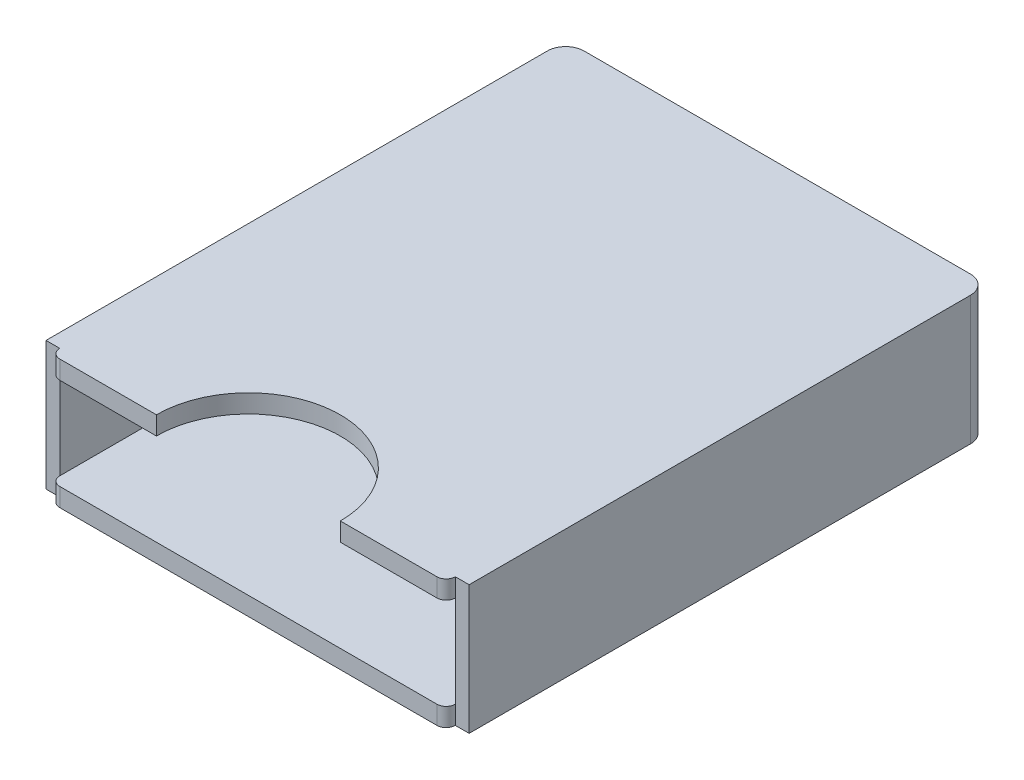
ISO-10303-21;
HEADER;
FILE_DESCRIPTION(('STEP AP214'),'2;1');
FILE_NAME('part.step','',(''),(''),'','','');
FILE_SCHEMA(('AUTOMOTIVE_DESIGN { 1 0 10303 214 1 1 1 1 }'));
ENDSEC;
DATA;
#1=APPLICATION_CONTEXT('core data for automotive mechanical design processes');
#2=APPLICATION_PROTOCOL_DEFINITION('international standard','automotive_design',2000,#1);
#3=PRODUCT_CONTEXT('',#1,'mechanical');
#4=PRODUCT('Part','Part','',(#3));
#5=PRODUCT_RELATED_PRODUCT_CATEGORY('part','',(#4));
#6=PRODUCT_DEFINITION_FORMATION('','',#4);
#7=PRODUCT_DEFINITION_CONTEXT('part definition',#1,'design');
#8=PRODUCT_DEFINITION('design','',#6,#7);
#9=PRODUCT_DEFINITION_SHAPE('','',#8);
#10=(LENGTH_UNIT() NAMED_UNIT(*) SI_UNIT(.MILLI.,.METRE.));
#11=(NAMED_UNIT(*) PLANE_ANGLE_UNIT() SI_UNIT($,.RADIAN.));
#12=(NAMED_UNIT(*) SI_UNIT($,.STERADIAN.) SOLID_ANGLE_UNIT());
#13=UNCERTAINTY_MEASURE_WITH_UNIT(LENGTH_MEASURE(1.E-05),#10,'distance_accuracy_value','');
#14=(GEOMETRIC_REPRESENTATION_CONTEXT(3) GLOBAL_UNCERTAINTY_ASSIGNED_CONTEXT((#13)) GLOBAL_UNIT_ASSIGNED_CONTEXT((#10,
#11,#12)) REPRESENTATION_CONTEXT('',''));
#15=CARTESIAN_POINT('',(0.,0.,0.));
#16=DIRECTION('',(0.,0.,1.));
#17=DIRECTION('',(1.,0.,0.));
#18=AXIS2_PLACEMENT_3D('',#15,#16,#17);
#19=CARTESIAN_POINT('',(0.,7.,14.));
#20=DIRECTION('',(0.,0.,1.));
#21=DIRECTION('',(1.,0.,0.));
#22=AXIS2_PLACEMENT_3D('',#19,#20,#21);
#23=PLANE('',#22);
#24=DIRECTION('',(0.,1.,0.));
#25=VECTOR('',#24,1.);
#26=CARTESIAN_POINT('',(5.,6.,14.));
#27=LINE('',#26,#25);
#28=CARTESIAN_POINT('',(5.,6.,14.));
#29=VERTEX_POINT('',#28);
#30=CARTESIAN_POINT('',(5.,7.,14.));
#31=VERTEX_POINT('',#30);
#32=EDGE_CURVE('E227',#29,#31,#27,.T.);
#33=ORIENTED_EDGE('',*,*,#32,.F.);
#34=DIRECTION('',(-1.,0.,0.));
#35=VECTOR('',#34,1.);
#36=CARTESIAN_POINT('',(0.,6.,14.));
#37=LINE('',#36,#35);
#38=CARTESIAN_POINT('',(10.25,6.,14.));
#39=VERTEX_POINT('',#38);
#40=EDGE_CURVE('E236',#39,#29,#37,.T.);
#41=ORIENTED_EDGE('',*,*,#40,.F.);
#42=DIRECTION('',(0.,-1.,0.));
#43=VECTOR('',#42,1.);
#44=CARTESIAN_POINT('',(10.25,7.,14.));
#45=LINE('',#44,#43);
#46=CARTESIAN_POINT('',(10.25,7.,14.));
#47=VERTEX_POINT('',#46);
#48=EDGE_CURVE('E264',#47,#39,#45,.T.);
#49=ORIENTED_EDGE('',*,*,#48,.F.);
#50=DIRECTION('',(-1.,0.,0.));
#51=VECTOR('',#50,1.);
#52=CARTESIAN_POINT('',(0.,7.,14.));
#53=LINE('',#52,#51);
#54=EDGE_CURVE('E261',#47,#31,#53,.T.);
#55=ORIENTED_EDGE('',*,*,#54,.T.);
#56=EDGE_LOOP('',(#33,#41,#49,#55));
#57=FACE_BOUND('',#56,.T.);
#58=ADVANCED_FACE('F35',(#57),#23,.T.);
#59=CARTESIAN_POINT('',(0.,1.,0.));
#60=DIRECTION('',(0.,1.,0.));
#61=DIRECTION('',(0.,0.,1.));
#62=AXIS2_PLACEMENT_3D('',#59,#60,#61);
#63=PLANE('',#62);
#64=DIRECTION('',(1.,0.,0.));
#65=VECTOR('',#64,1.);
#66=CARTESIAN_POINT('',(0.,1.,-14.));
#67=LINE('',#66,#65);
#68=CARTESIAN_POINT('',(5.,1.,-14.));
#69=VERTEX_POINT('',#68);
#70=CARTESIAN_POINT('',(10.25,1.,-14.));
#71=VERTEX_POINT('',#70);
#72=EDGE_CURVE('E313',#69,#71,#67,.T.);
#73=ORIENTED_EDGE('',*,*,#72,.F.);
#74=DIRECTION('',(0.,0.,-1.));
#75=VECTOR('',#74,1.);
#76=CARTESIAN_POINT('',(5.,1.,-4.75));
#77=LINE('',#76,#75);
#78=CARTESIAN_POINT('',(5.,1.,-14.75));
#79=VERTEX_POINT('',#78);
#80=EDGE_CURVE('E201',#69,#79,#77,.T.);
#81=ORIENTED_EDGE('',*,*,#80,.T.);
#82=DIRECTION('',(-1.,0.,0.));
#83=VECTOR('',#82,1.);
#84=CARTESIAN_POINT('',(-5.,1.,-14.75));
#85=LINE('',#84,#83);
#86=CARTESIAN_POINT('',(-5.,1.,-14.75));
#87=VERTEX_POINT('',#86);
#88=EDGE_CURVE('E212',#79,#87,#85,.T.);
#89=ORIENTED_EDGE('',*,*,#88,.T.);
#90=DIRECTION('',(0.,0.,-1.));
#91=VECTOR('',#90,1.);
#92=CARTESIAN_POINT('',(-5.,1.,-4.75));
#93=LINE('',#92,#91);
#94=CARTESIAN_POINT('',(-5.,1.,-14.));
#95=VERTEX_POINT('',#94);
#96=EDGE_CURVE('E217',#95,#87,#93,.T.);
#97=ORIENTED_EDGE('',*,*,#96,.F.);
#98=CARTESIAN_POINT('',(-10.25,1.,-14.));
#99=VERTEX_POINT('',#98);
#100=EDGE_CURVE('E314',#99,#95,#67,.T.);
#101=ORIENTED_EDGE('',*,*,#100,.F.);
#102=CARTESIAN_POINT('',(-10.25,1.,-13.5));
#103=DIRECTION('',(0.,1.,0.));
#104=DIRECTION('',(0.,0.,1.));
#105=AXIS2_PLACEMENT_3D('',#102,#103,#104);
#106=CIRCLE('',#105,0.5);
#107=CARTESIAN_POINT('',(-10.75,1.,-13.5));
#108=VERTEX_POINT('',#107);
#109=EDGE_CURVE('E317',#99,#108,#106,.T.);
#110=ORIENTED_EDGE('',*,*,#109,.T.);
#111=DIRECTION('',(0.,0.,-1.));
#112=VECTOR('',#111,1.);
#113=CARTESIAN_POINT('',(-10.75,1.,0.));
#114=LINE('',#113,#112);
#115=CARTESIAN_POINT('',(-10.75,1.,13.5));
#116=VERTEX_POINT('',#115);
#117=EDGE_CURVE('E319',#116,#108,#114,.T.);
#118=ORIENTED_EDGE('',*,*,#117,.F.);
#119=CARTESIAN_POINT('',(-10.25,1.,13.5));
#120=DIRECTION('',(0.,1.,0.));
#121=DIRECTION('',(0.,0.,1.));
#122=AXIS2_PLACEMENT_3D('',#119,#120,#121);
#123=CIRCLE('',#122,0.5);
#124=CARTESIAN_POINT('',(-10.25,1.,14.));
#125=VERTEX_POINT('',#124);
#126=EDGE_CURVE('E330',#116,#125,#123,.T.);
#127=ORIENTED_EDGE('',*,*,#126,.T.);
#128=DIRECTION('',(-1.,0.,0.));
#129=VECTOR('',#128,1.);
#130=CARTESIAN_POINT('',(0.,1.,14.));
#131=LINE('',#130,#129);
#132=CARTESIAN_POINT('',(10.25,1.,14.));
#133=VERTEX_POINT('',#132);
#134=EDGE_CURVE('E333',#133,#125,#131,.T.);
#135=ORIENTED_EDGE('',*,*,#134,.F.);
#136=CARTESIAN_POINT('',(10.25,1.,13.5));
#137=DIRECTION('',(0.,1.,0.));
#138=DIRECTION('',(0.,0.,1.));
#139=AXIS2_PLACEMENT_3D('',#136,#137,#138);
#140=CIRCLE('',#139,0.5);
#141=CARTESIAN_POINT('',(10.75,1.,13.5));
#142=VERTEX_POINT('',#141);
#143=EDGE_CURVE('E328',#133,#142,#140,.T.);
#144=ORIENTED_EDGE('',*,*,#143,.T.);
#145=DIRECTION('',(0.,0.,-1.));
#146=VECTOR('',#145,1.);
#147=CARTESIAN_POINT('',(10.75,1.,0.));
#148=LINE('',#147,#146);
#149=CARTESIAN_POINT('',(10.75,1.,-13.5));
#150=VERTEX_POINT('',#149);
#151=EDGE_CURVE('E322',#142,#150,#148,.T.);
#152=ORIENTED_EDGE('',*,*,#151,.T.);
#153=CARTESIAN_POINT('',(10.25,1.,-13.5));
#154=DIRECTION('',(0.,1.,0.));
#155=DIRECTION('',(0.,0.,1.));
#156=AXIS2_PLACEMENT_3D('',#153,#154,#155);
#157=CIRCLE('',#156,0.5);
#158=EDGE_CURVE('E324',#71,#150,#157,.F.);
#159=ORIENTED_EDGE('',*,*,#158,.F.);
#160=EDGE_LOOP('',(#73,#81,#89,#97,#101,#110,#118,#127,#135,#144,#152,#159));
#161=FACE_BOUND('',#160,.T.);
#162=ADVANCED_FACE('F395',(#161),#63,.T.);
#163=CARTESIAN_POINT('',(10.25,1.,13.5));
#164=DIRECTION('',(0.,-1.,0.));
#165=DIRECTION('',(0.,0.,-1.));
#166=AXIS2_PLACEMENT_3D('',#163,#164,#165);
#167=CYLINDRICAL_SURFACE('',#166,0.5);
#168=CARTESIAN_POINT('',(10.25,0.,13.5));
#169=DIRECTION('',(0.,1.,0.));
#170=DIRECTION('',(0.,0.,1.));
#171=AXIS2_PLACEMENT_3D('',#168,#169,#170);
#172=CIRCLE('',#171,0.5);
#173=CARTESIAN_POINT('',(10.25,0.,14.));
#174=VERTEX_POINT('',#173);
#175=CARTESIAN_POINT('',(10.75,0.,13.5));
#176=VERTEX_POINT('',#175);
#177=EDGE_CURVE('E327',#174,#176,#172,.T.);
#178=ORIENTED_EDGE('',*,*,#177,.T.);
#179=DIRECTION('',(0.,-1.,0.));
#180=VECTOR('',#179,1.);
#181=CARTESIAN_POINT('',(10.75,1.,13.5));
#182=LINE('',#181,#180);
#183=EDGE_CURVE('E382',#142,#176,#182,.T.);
#184=ORIENTED_EDGE('',*,*,#183,.F.);
#185=ORIENTED_EDGE('',*,*,#143,.F.);
#186=DIRECTION('',(0.,-1.,0.));
#187=VECTOR('',#186,1.);
#188=CARTESIAN_POINT('',(10.25,1.,14.));
#189=LINE('',#188,#187);
#190=EDGE_CURVE('E336',#133,#174,#189,.T.);
#191=ORIENTED_EDGE('',*,*,#190,.T.);
#192=EDGE_LOOP('',(#178,#184,#185,#191));
#193=FACE_BOUND('',#192,.T.);
#194=ADVANCED_FACE('F37',(#193),#167,.T.);
#195=CARTESIAN_POINT('',(0.,1.,13.4999999999999));
#196=DIRECTION('',(0.,0.,-1.));
#197=DIRECTION('',(-1.,0.,0.));
#198=AXIS2_PLACEMENT_3D('',#195,#196,#197);
#199=PLANE('',#198);
#200=DIRECTION('',(1.,0.,0.));
#201=VECTOR('',#200,1.);
#202=CARTESIAN_POINT('',(0.,0.,13.4999999999999));
#203=LINE('',#202,#201);
#204=CARTESIAN_POINT('',(11.5,0.,13.5));
#205=VERTEX_POINT('',#204);
#206=EDGE_CURVE('E339',#176,#205,#203,.T.);
#207=ORIENTED_EDGE('',*,*,#206,.T.);
#208=DIRECTION('',(0.,-1.,0.));
#209=VECTOR('',#208,1.);
#210=CARTESIAN_POINT('',(11.5,1.,13.5));
#211=LINE('',#210,#209);
#212=CARTESIAN_POINT('',(11.5,7.,13.5));
#213=VERTEX_POINT('',#212);
#214=EDGE_CURVE('E380',#213,#205,#211,.T.);
#215=ORIENTED_EDGE('',*,*,#214,.F.);
#216=DIRECTION('',(1.,0.,0.));
#217=VECTOR('',#216,1.);
#218=CARTESIAN_POINT('',(0.,7.,13.4999999999999));
#219=LINE('',#218,#217);
#220=CARTESIAN_POINT('',(10.75,7.,13.5));
#221=VERTEX_POINT('',#220);
#222=EDGE_CURVE('E235',#221,#213,#219,.T.);
#223=ORIENTED_EDGE('',*,*,#222,.F.);
#224=DIRECTION('',(0.,-1.,0.));
#225=VECTOR('',#224,1.);
#226=CARTESIAN_POINT('',(10.75,7.,13.5));
#227=LINE('',#226,#225);
#228=CARTESIAN_POINT('',(10.75,6.,13.5));
#229=VERTEX_POINT('',#228);
#230=EDGE_CURVE('E279',#221,#229,#227,.T.);
#231=ORIENTED_EDGE('',*,*,#230,.T.);
#232=DIRECTION('',(0.,-1.,0.));
#233=VECTOR('',#232,1.);
#234=CARTESIAN_POINT('',(10.75,6.,13.5));
#235=LINE('',#234,#233);
#236=EDGE_CURVE('E307',#229,#142,#235,.T.);
#237=ORIENTED_EDGE('',*,*,#236,.T.);
#238=ORIENTED_EDGE('',*,*,#183,.T.);
#239=EDGE_LOOP('',(#207,#215,#223,#231,#237,#238));
#240=FACE_BOUND('',#239,.T.);
#241=ADVANCED_FACE('F428',(#240),#199,.F.);
#242=CARTESIAN_POINT('',(11.5,1.,0.));
#243=DIRECTION('',(1.,0.,0.));
#244=DIRECTION('',(0.,0.,-1.));
#245=AXIS2_PLACEMENT_3D('',#242,#243,#244);
#246=PLANE('',#245);
#247=DIRECTION('',(0.,0.,1.));
#248=VECTOR('',#247,1.);
#249=CARTESIAN_POINT('',(11.5,0.,0.));
#250=LINE('',#249,#248);
#251=CARTESIAN_POINT('',(11.5,0.,-13.75));
#252=VERTEX_POINT('',#251);
#253=EDGE_CURVE('E342',#252,#205,#250,.T.);
#254=ORIENTED_EDGE('',*,*,#253,.F.);
#255=DIRECTION('',(0.,-1.,0.));
#256=VECTOR('',#255,1.);
#257=CARTESIAN_POINT('',(11.5,1.,-13.75));
#258=LINE('',#257,#256);
#259=CARTESIAN_POINT('',(11.5,7.,-13.75));
#260=VERTEX_POINT('',#259);
#261=EDGE_CURVE('E378',#260,#252,#258,.T.);
#262=ORIENTED_EDGE('',*,*,#261,.F.);
#263=DIRECTION('',(0.,0.,1.));
#264=VECTOR('',#263,1.);
#265=CARTESIAN_POINT('',(11.5,7.,0.));
#266=LINE('',#265,#264);
#267=EDGE_CURVE('E239',#260,#213,#266,.T.);
#268=ORIENTED_EDGE('',*,*,#267,.T.);
#269=ORIENTED_EDGE('',*,*,#214,.T.);
#270=EDGE_LOOP('',(#254,#262,#268,#269));
#271=FACE_BOUND('',#270,.T.);
#272=ADVANCED_FACE('F467',(#271),#246,.T.);
#273=CARTESIAN_POINT('',(10.5,1.,-13.75));
#274=DIRECTION('',(0.,-1.,0.));
#275=DIRECTION('',(0.,0.,-1.));
#276=AXIS2_PLACEMENT_3D('',#273,#274,#275);
#277=CYLINDRICAL_SURFACE('',#276,1.);
#278=CARTESIAN_POINT('',(10.5,0.,-13.75));
#279=DIRECTION('',(0.,1.,0.));
#280=DIRECTION('',(0.,0.,1.));
#281=AXIS2_PLACEMENT_3D('',#278,#279,#280);
#282=CIRCLE('',#281,1.);
#283=CARTESIAN_POINT('',(10.5,0.,-14.75));
#284=VERTEX_POINT('',#283);
#285=EDGE_CURVE('E345',#252,#284,#282,.T.);
#286=ORIENTED_EDGE('',*,*,#285,.T.);
#287=DIRECTION('',(0.,-1.,0.));
#288=VECTOR('',#287,1.);
#289=CARTESIAN_POINT('',(10.5,1.,-14.75));
#290=LINE('',#289,#288);
#291=CARTESIAN_POINT('',(10.5,7.,-14.75));
#292=VERTEX_POINT('',#291);
#293=EDGE_CURVE('E375',#292,#284,#290,.T.);
#294=ORIENTED_EDGE('',*,*,#293,.F.);
#295=CARTESIAN_POINT('',(10.5,7.,-13.75));
#296=DIRECTION('',(0.,1.,0.));
#297=DIRECTION('',(0.,0.,1.));
#298=AXIS2_PLACEMENT_3D('',#295,#296,#297);
#299=CIRCLE('',#298,1.);
#300=EDGE_CURVE('E242',#260,#292,#299,.T.);
#301=ORIENTED_EDGE('',*,*,#300,.F.);
#302=ORIENTED_EDGE('',*,*,#261,.T.);
#303=EDGE_LOOP('',(#286,#294,#301,#302));
#304=FACE_BOUND('',#303,.T.);
#305=ADVANCED_FACE('F470',(#304),#277,.T.);
#306=CARTESIAN_POINT('',(0.,1.,-14.75));
#307=DIRECTION('',(0.,0.,1.));
#308=DIRECTION('',(1.,0.,0.));
#309=AXIS2_PLACEMENT_3D('',#306,#307,#308);
#310=PLANE('',#309);
#311=DIRECTION('',(1.,0.,0.));
#312=VECTOR('',#311,1.);
#313=CARTESIAN_POINT('',(-5.,3.,-14.75));
#314=LINE('',#313,#312);
#315=CARTESIAN_POINT('',(-5.,3.,-14.75));
#316=VERTEX_POINT('',#315);
#317=CARTESIAN_POINT('',(5.,3.,-14.75));
#318=VERTEX_POINT('',#317);
#319=EDGE_CURVE('E205',#316,#318,#314,.T.);
#320=ORIENTED_EDGE('',*,*,#319,.F.);
#321=DIRECTION('',(0.,1.,0.));
#322=VECTOR('',#321,1.);
#323=CARTESIAN_POINT('',(-5.,1.,-14.75));
#324=LINE('',#323,#322);
#325=EDGE_CURVE('E50',#87,#316,#324,.T.);
#326=ORIENTED_EDGE('',*,*,#325,.F.);
#327=ORIENTED_EDGE('',*,*,#88,.F.);
#328=DIRECTION('',(0.,-1.,0.));
#329=VECTOR('',#328,1.);
#330=CARTESIAN_POINT('',(5.,1.,-14.75));
#331=LINE('',#330,#329);
#332=EDGE_CURVE('E197',#318,#79,#331,.T.);
#333=ORIENTED_EDGE('',*,*,#332,.F.);
#334=EDGE_LOOP('',(#320,#326,#327,#333));
#335=FACE_BOUND('',#334,.T.);
#336=DIRECTION('',(-1.,0.,0.));
#337=VECTOR('',#336,1.);
#338=CARTESIAN_POINT('',(0.,0.,-14.75));
#339=LINE('',#338,#337);
#340=CARTESIAN_POINT('',(-10.5,0.,-14.75));
#341=VERTEX_POINT('',#340);
#342=EDGE_CURVE('E347',#284,#341,#339,.T.);
#343=ORIENTED_EDGE('',*,*,#342,.T.);
#344=DIRECTION('',(0.,-1.,0.));
#345=VECTOR('',#344,1.);
#346=CARTESIAN_POINT('',(-10.5,1.,-14.75));
#347=LINE('',#346,#345);
#348=CARTESIAN_POINT('',(-10.5,7.,-14.75));
#349=VERTEX_POINT('',#348);
#350=EDGE_CURVE('E373',#349,#341,#347,.T.);
#351=ORIENTED_EDGE('',*,*,#350,.F.);
#352=DIRECTION('',(-1.,0.,0.));
#353=VECTOR('',#352,1.);
#354=CARTESIAN_POINT('',(0.,7.,-14.75));
#355=LINE('',#354,#353);
#356=EDGE_CURVE('E245',#292,#349,#355,.T.);
#357=ORIENTED_EDGE('',*,*,#356,.F.);
#358=ORIENTED_EDGE('',*,*,#293,.T.);
#359=EDGE_LOOP('',(#343,#351,#357,#358));
#360=FACE_BOUND('',#359,.T.);
#361=ADVANCED_FACE('F209',(#335,#360),#310,.F.);
#362=CARTESIAN_POINT('',(-10.5,1.,-13.75));
#363=DIRECTION('',(0.,-1.,0.));
#364=DIRECTION('',(0.,0.,-1.));
#365=AXIS2_PLACEMENT_3D('',#362,#363,#364);
#366=CYLINDRICAL_SURFACE('',#365,1.);
#367=CARTESIAN_POINT('',(-10.5,0.,-13.75));
#368=DIRECTION('',(0.,1.,0.));
#369=DIRECTION('',(0.,0.,1.));
#370=AXIS2_PLACEMENT_3D('',#367,#368,#369);
#371=CIRCLE('',#370,1.);
#372=CARTESIAN_POINT('',(-11.5,0.,-13.75));
#373=VERTEX_POINT('',#372);
#374=EDGE_CURVE('E350',#373,#341,#371,.F.);
#375=ORIENTED_EDGE('',*,*,#374,.F.);
#376=DIRECTION('',(0.,-1.,0.));
#377=VECTOR('',#376,1.);
#378=CARTESIAN_POINT('',(-11.5,1.,-13.75));
#379=LINE('',#378,#377);
#380=CARTESIAN_POINT('',(-11.5,7.,-13.75));
#381=VERTEX_POINT('',#380);
#382=EDGE_CURVE('E371',#381,#373,#379,.T.);
#383=ORIENTED_EDGE('',*,*,#382,.F.);
#384=CARTESIAN_POINT('',(-10.5,7.,-13.75));
#385=DIRECTION('',(0.,1.,0.));
#386=DIRECTION('',(0.,0.,1.));
#387=AXIS2_PLACEMENT_3D('',#384,#385,#386);
#388=CIRCLE('',#387,1.);
#389=EDGE_CURVE('E248',#381,#349,#388,.F.);
#390=ORIENTED_EDGE('',*,*,#389,.T.);
#391=ORIENTED_EDGE('',*,*,#350,.T.);
#392=EDGE_LOOP('',(#375,#383,#390,#391));
#393=FACE_BOUND('',#392,.T.);
#394=ADVANCED_FACE('F474',(#393),#366,.T.);
#395=CARTESIAN_POINT('',(-11.5,1.,0.));
#396=DIRECTION('',(1.,0.,0.));
#397=DIRECTION('',(0.,0.,-1.));
#398=AXIS2_PLACEMENT_3D('',#395,#396,#397);
#399=PLANE('',#398);
#400=DIRECTION('',(0.,0.,1.));
#401=VECTOR('',#400,1.);
#402=CARTESIAN_POINT('',(-11.5,0.,0.));
#403=LINE('',#402,#401);
#404=CARTESIAN_POINT('',(-11.5,0.,13.5));
#405=VERTEX_POINT('',#404);
#406=EDGE_CURVE('E353',#373,#405,#403,.T.);
#407=ORIENTED_EDGE('',*,*,#406,.T.);
#408=DIRECTION('',(0.,-1.,0.));
#409=VECTOR('',#408,1.);
#410=CARTESIAN_POINT('',(-11.5,1.,13.5));
#411=LINE('',#410,#409);
#412=CARTESIAN_POINT('',(-11.5,7.,13.5));
#413=VERTEX_POINT('',#412);
#414=EDGE_CURVE('E369',#413,#405,#411,.T.);
#415=ORIENTED_EDGE('',*,*,#414,.F.);
#416=DIRECTION('',(0.,0.,1.));
#417=VECTOR('',#416,1.);
#418=CARTESIAN_POINT('',(-11.5,7.,0.));
#419=LINE('',#418,#417);
#420=EDGE_CURVE('E251',#381,#413,#419,.T.);
#421=ORIENTED_EDGE('',*,*,#420,.F.);
#422=ORIENTED_EDGE('',*,*,#382,.T.);
#423=EDGE_LOOP('',(#407,#415,#421,#422));
#424=FACE_BOUND('',#423,.T.);
#425=ADVANCED_FACE('F458',(#424),#399,.F.);
#426=CARTESIAN_POINT('',(0.,1.,13.4999999999999));
#427=DIRECTION('',(0.,0.,1.));
#428=DIRECTION('',(1.,0.,0.));
#429=AXIS2_PLACEMENT_3D('',#426,#427,#428);
#430=PLANE('',#429);
#431=DIRECTION('',(-1.,0.,0.));
#432=VECTOR('',#431,1.);
#433=CARTESIAN_POINT('',(0.,0.,13.4999999999999));
#434=LINE('',#433,#432);
#435=CARTESIAN_POINT('',(-10.75,0.,13.5));
#436=VERTEX_POINT('',#435);
#437=EDGE_CURVE('E356',#436,#405,#434,.T.);
#438=ORIENTED_EDGE('',*,*,#437,.F.);
#439=DIRECTION('',(0.,-1.,0.));
#440=VECTOR('',#439,1.);
#441=CARTESIAN_POINT('',(-10.75,1.,13.5));
#442=LINE('',#441,#440);
#443=EDGE_CURVE('E367',#116,#436,#442,.T.);
#444=ORIENTED_EDGE('',*,*,#443,.F.);
#445=DIRECTION('',(0.,-1.,0.));
#446=VECTOR('',#445,1.);
#447=CARTESIAN_POINT('',(-10.75,6.,13.5));
#448=LINE('',#447,#446);
#449=CARTESIAN_POINT('',(-10.75,6.,13.5));
#450=VERTEX_POINT('',#449);
#451=EDGE_CURVE('E304',#450,#116,#448,.T.);
#452=ORIENTED_EDGE('',*,*,#451,.F.);
#453=DIRECTION('',(0.,-1.,0.));
#454=VECTOR('',#453,1.);
#455=CARTESIAN_POINT('',(-10.75,7.,13.5));
#456=LINE('',#455,#454);
#457=CARTESIAN_POINT('',(-10.75,7.,13.5));
#458=VERTEX_POINT('',#457);
#459=EDGE_CURVE('E277',#458,#450,#456,.T.);
#460=ORIENTED_EDGE('',*,*,#459,.F.);
#461=DIRECTION('',(-1.,0.,0.));
#462=VECTOR('',#461,1.);
#463=CARTESIAN_POINT('',(0.,7.,13.4999999999999));
#464=LINE('',#463,#462);
#465=EDGE_CURVE('E254',#458,#413,#464,.T.);
#466=ORIENTED_EDGE('',*,*,#465,.T.);
#467=ORIENTED_EDGE('',*,*,#414,.T.);
#468=EDGE_LOOP('',(#438,#444,#452,#460,#466,#467));
#469=FACE_BOUND('',#468,.T.);
#470=ADVANCED_FACE('F409',(#469),#430,.T.);
#471=CARTESIAN_POINT('',(-10.25,1.,13.5));
#472=DIRECTION('',(0.,-1.,0.));
#473=DIRECTION('',(0.,0.,-1.));
#474=AXIS2_PLACEMENT_3D('',#471,#472,#473);
#475=CYLINDRICAL_SURFACE('',#474,0.5);
#476=CARTESIAN_POINT('',(-10.25,0.,13.5));
#477=DIRECTION('',(0.,1.,0.));
#478=DIRECTION('',(0.,0.,1.));
#479=AXIS2_PLACEMENT_3D('',#476,#477,#478);
#480=CIRCLE('',#479,0.5);
#481=CARTESIAN_POINT('',(-10.25,0.,14.));
#482=VERTEX_POINT('',#481);
#483=EDGE_CURVE('E359',#436,#482,#480,.T.);
#484=ORIENTED_EDGE('',*,*,#483,.T.);
#485=DIRECTION('',(0.,-1.,0.));
#486=VECTOR('',#485,1.);
#487=CARTESIAN_POINT('',(-10.25,1.,14.));
#488=LINE('',#487,#486);
#489=EDGE_CURVE('E365',#125,#482,#488,.T.);
#490=ORIENTED_EDGE('',*,*,#489,.F.);
#491=ORIENTED_EDGE('',*,*,#126,.F.);
#492=ORIENTED_EDGE('',*,*,#443,.T.);
#493=EDGE_LOOP('',(#484,#490,#491,#492));
#494=FACE_BOUND('',#493,.T.);
#495=ADVANCED_FACE('F412',(#494),#475,.T.);
#496=CARTESIAN_POINT('',(0.,1.,14.));
#497=DIRECTION('',(0.,0.,1.));
#498=DIRECTION('',(1.,0.,0.));
#499=AXIS2_PLACEMENT_3D('',#496,#497,#498);
#500=PLANE('',#499);
#501=DIRECTION('',(-1.,0.,0.));
#502=VECTOR('',#501,1.);
#503=CARTESIAN_POINT('',(0.,0.,14.));
#504=LINE('',#503,#502);
#505=EDGE_CURVE('E331',#174,#482,#504,.T.);
#506=ORIENTED_EDGE('',*,*,#505,.F.);
#507=ORIENTED_EDGE('',*,*,#190,.F.);
#508=ORIENTED_EDGE('',*,*,#134,.T.);
#509=ORIENTED_EDGE('',*,*,#489,.T.);
#510=EDGE_LOOP('',(#506,#507,#508,#509));
#511=FACE_BOUND('',#510,.T.);
#512=ADVANCED_FACE('F415',(#511),#500,.T.);
#513=CARTESIAN_POINT('',(0.,0.,0.));
#514=DIRECTION('',(0.,1.,0.));
#515=DIRECTION('',(0.,0.,1.));
#516=AXIS2_PLACEMENT_3D('',#513,#514,#515);
#517=PLANE('',#516);
#518=ORIENTED_EDGE('',*,*,#483,.F.);
#519=ORIENTED_EDGE('',*,*,#437,.T.);
#520=ORIENTED_EDGE('',*,*,#406,.F.);
#521=ORIENTED_EDGE('',*,*,#374,.T.);
#522=ORIENTED_EDGE('',*,*,#342,.F.);
#523=ORIENTED_EDGE('',*,*,#285,.F.);
#524=ORIENTED_EDGE('',*,*,#253,.T.);
#525=ORIENTED_EDGE('',*,*,#206,.F.);
#526=ORIENTED_EDGE('',*,*,#177,.F.);
#527=ORIENTED_EDGE('',*,*,#505,.T.);
#528=EDGE_LOOP('',(#518,#519,#520,#521,#522,#523,#524,#525,#526,#527));
#529=FACE_BOUND('',#528,.T.);
#530=ADVANCED_FACE('F462',(#529),#517,.F.);
#531=CARTESIAN_POINT('',(10.25,6.,-13.5));
#532=DIRECTION('',(0.,-1.,0.));
#533=DIRECTION('',(0.,0.,-1.));
#534=AXIS2_PLACEMENT_3D('',#531,#532,#533);
#535=CYLINDRICAL_SURFACE('',#534,0.5);
#536=DIRECTION('',(0.,-1.,0.));
#537=VECTOR('',#536,1.);
#538=CARTESIAN_POINT('',(10.25,6.,-14.));
#539=LINE('',#538,#537);
#540=CARTESIAN_POINT('',(10.25,6.,-14.));
#541=VERTEX_POINT('',#540);
#542=EDGE_CURVE('E295',#541,#71,#539,.T.);
#543=ORIENTED_EDGE('',*,*,#542,.T.);
#544=ORIENTED_EDGE('',*,*,#158,.T.);
#545=DIRECTION('',(0.,-1.,0.));
#546=VECTOR('',#545,1.);
#547=CARTESIAN_POINT('',(10.75,6.,-13.5));
#548=LINE('',#547,#546);
#549=CARTESIAN_POINT('',(10.75,6.,-13.5));
#550=VERTEX_POINT('',#549);
#551=EDGE_CURVE('E310',#550,#150,#548,.T.);
#552=ORIENTED_EDGE('',*,*,#551,.F.);
#553=CARTESIAN_POINT('',(10.25,6.,-13.5));
#554=DIRECTION('',(0.,1.,0.));
#555=DIRECTION('',(0.,0.,1.));
#556=AXIS2_PLACEMENT_3D('',#553,#554,#555);
#557=CIRCLE('',#556,0.5);
#558=EDGE_CURVE('E282',#550,#541,#557,.T.);
#559=ORIENTED_EDGE('',*,*,#558,.T.);
#560=EDGE_LOOP('',(#543,#544,#552,#559));
#561=FACE_BOUND('',#560,.T.);
#562=ADVANCED_FACE('F510',(#561),#535,.F.);
#563=CARTESIAN_POINT('',(10.75,6.,0.));
#564=DIRECTION('',(1.,0.,0.));
#565=DIRECTION('',(0.,0.,-1.));
#566=AXIS2_PLACEMENT_3D('',#563,#564,#565);
#567=PLANE('',#566);
#568=ORIENTED_EDGE('',*,*,#151,.F.);
#569=ORIENTED_EDGE('',*,*,#236,.F.);
#570=DIRECTION('',(0.,0.,1.));
#571=VECTOR('',#570,1.);
#572=CARTESIAN_POINT('',(10.75,6.,0.));
#573=LINE('',#572,#571);
#574=EDGE_CURVE('E285',#550,#229,#573,.T.);
#575=ORIENTED_EDGE('',*,*,#574,.F.);
#576=ORIENTED_EDGE('',*,*,#551,.T.);
#577=EDGE_LOOP('',(#568,#569,#575,#576));
#578=FACE_BOUND('',#577,.T.);
#579=ADVANCED_FACE('F425',(#578),#567,.F.);
#580=CARTESIAN_POINT('',(-10.75,6.,0.));
#581=DIRECTION('',(1.,0.,0.));
#582=DIRECTION('',(0.,0.,-1.));
#583=AXIS2_PLACEMENT_3D('',#580,#581,#582);
#584=PLANE('',#583);
#585=ORIENTED_EDGE('',*,*,#451,.T.);
#586=ORIENTED_EDGE('',*,*,#117,.T.);
#587=DIRECTION('',(0.,-1.,0.));
#588=VECTOR('',#587,1.);
#589=CARTESIAN_POINT('',(-10.75,6.,-13.5));
#590=LINE('',#589,#588);
#591=CARTESIAN_POINT('',(-10.75,6.,-13.5));
#592=VERTEX_POINT('',#591);
#593=EDGE_CURVE('E301',#592,#108,#590,.T.);
#594=ORIENTED_EDGE('',*,*,#593,.F.);
#595=DIRECTION('',(0.,0.,1.));
#596=VECTOR('',#595,1.);
#597=CARTESIAN_POINT('',(-10.75,6.,0.));
#598=LINE('',#597,#596);
#599=EDGE_CURVE('E287',#592,#450,#598,.T.);
#600=ORIENTED_EDGE('',*,*,#599,.T.);
#601=EDGE_LOOP('',(#585,#586,#594,#600));
#602=FACE_BOUND('',#601,.T.);
#603=ADVANCED_FACE('F401',(#602),#584,.T.);
#604=CARTESIAN_POINT('',(-10.25,6.,-13.5));
#605=DIRECTION('',(0.,-1.,0.));
#606=DIRECTION('',(0.,0.,-1.));
#607=AXIS2_PLACEMENT_3D('',#604,#605,#606);
#608=CYLINDRICAL_SURFACE('',#607,0.5);
#609=ORIENTED_EDGE('',*,*,#109,.F.);
#610=DIRECTION('',(0.,-1.,0.));
#611=VECTOR('',#610,1.);
#612=CARTESIAN_POINT('',(-10.25,6.,-14.));
#613=LINE('',#612,#611);
#614=CARTESIAN_POINT('',(-10.25,6.,-14.));
#615=VERTEX_POINT('',#614);
#616=EDGE_CURVE('E298',#615,#99,#613,.T.);
#617=ORIENTED_EDGE('',*,*,#616,.F.);
#618=CARTESIAN_POINT('',(-10.25,6.,-13.5));
#619=DIRECTION('',(0.,1.,0.));
#620=DIRECTION('',(0.,0.,1.));
#621=AXIS2_PLACEMENT_3D('',#618,#619,#620);
#622=CIRCLE('',#621,0.5);
#623=EDGE_CURVE('E290',#592,#615,#622,.F.);
#624=ORIENTED_EDGE('',*,*,#623,.F.);
#625=ORIENTED_EDGE('',*,*,#593,.T.);
#626=EDGE_LOOP('',(#609,#617,#624,#625));
#627=FACE_BOUND('',#626,.T.);
#628=ADVANCED_FACE('F397',(#627),#608,.F.);
#629=CARTESIAN_POINT('',(0.,6.,-14.));
#630=DIRECTION('',(0.,0.,1.));
#631=DIRECTION('',(1.,0.,0.));
#632=AXIS2_PLACEMENT_3D('',#629,#630,#631);
#633=PLANE('',#632);
#634=DIRECTION('',(0.,-1.,0.));
#635=VECTOR('',#634,1.);
#636=CARTESIAN_POINT('',(-5.,6.,-14.));
#637=LINE('',#636,#635);
#638=CARTESIAN_POINT('',(-5.,3.,-14.));
#639=VERTEX_POINT('',#638);
#640=EDGE_CURVE('E11',#639,#95,#637,.T.);
#641=ORIENTED_EDGE('',*,*,#640,.F.);
#642=DIRECTION('',(-1.,0.,0.));
#643=VECTOR('',#642,1.);
#644=CARTESIAN_POINT('',(0.,3.,-14.));
#645=LINE('',#644,#643);
#646=CARTESIAN_POINT('',(5.,3.,-14.));
#647=VERTEX_POINT('',#646);
#648=EDGE_CURVE('E385',#647,#639,#645,.T.);
#649=ORIENTED_EDGE('',*,*,#648,.F.);
#650=DIRECTION('',(0.,1.,0.));
#651=VECTOR('',#650,1.);
#652=CARTESIAN_POINT('',(5.,6.,-14.));
#653=LINE('',#652,#651);
#654=EDGE_CURVE('E43',#69,#647,#653,.T.);
#655=ORIENTED_EDGE('',*,*,#654,.F.);
#656=ORIENTED_EDGE('',*,*,#72,.T.);
#657=ORIENTED_EDGE('',*,*,#542,.F.);
#658=DIRECTION('',(-1.,0.,0.));
#659=VECTOR('',#658,1.);
#660=CARTESIAN_POINT('',(0.,6.,-14.));
#661=LINE('',#660,#659);
#662=EDGE_CURVE('E292',#541,#615,#661,.T.);
#663=ORIENTED_EDGE('',*,*,#662,.T.);
#664=ORIENTED_EDGE('',*,*,#616,.T.);
#665=ORIENTED_EDGE('',*,*,#100,.T.);
#666=EDGE_LOOP('',(#641,#649,#655,#656,#657,#663,#664,#665));
#667=FACE_BOUND('',#666,.T.);
#668=ADVANCED_FACE('F390',(#667),#633,.T.);
#669=CARTESIAN_POINT('',(0.,6.,0.));
#670=DIRECTION('',(0.,1.,0.));
#671=DIRECTION('',(0.,0.,1.));
#672=AXIS2_PLACEMENT_3D('',#669,#670,#671);
#673=PLANE('',#672);
#674=ORIENTED_EDGE('',*,*,#40,.T.);
#675=CARTESIAN_POINT('',(0.,6.,14.));
#676=DIRECTION('',(0.,1.,0.));
#677=DIRECTION('',(0.,0.,1.));
#678=AXIS2_PLACEMENT_3D('',#675,#676,#677);
#679=CIRCLE('',#678,5.);
#680=CARTESIAN_POINT('',(-5.,6.,14.));
#681=VERTEX_POINT('',#680);
#682=EDGE_CURVE('E222',#29,#681,#679,.T.);
#683=ORIENTED_EDGE('',*,*,#682,.T.);
#684=CARTESIAN_POINT('',(-10.25,6.,14.));
#685=VERTEX_POINT('',#684);
#686=EDGE_CURVE('E270',#681,#685,#37,.T.);
#687=ORIENTED_EDGE('',*,*,#686,.T.);
#688=CARTESIAN_POINT('',(-10.25,6.,13.5));
#689=DIRECTION('',(0.,1.,0.));
#690=DIRECTION('',(0.,0.,1.));
#691=AXIS2_PLACEMENT_3D('',#688,#689,#690);
#692=CIRCLE('',#691,0.5);
#693=EDGE_CURVE('E267',#450,#685,#692,.T.);
#694=ORIENTED_EDGE('',*,*,#693,.F.);
#695=ORIENTED_EDGE('',*,*,#599,.F.);
#696=ORIENTED_EDGE('',*,*,#623,.T.);
#697=ORIENTED_EDGE('',*,*,#662,.F.);
#698=ORIENTED_EDGE('',*,*,#558,.F.);
#699=ORIENTED_EDGE('',*,*,#574,.T.);
#700=CARTESIAN_POINT('',(10.25,6.,13.5));
#701=DIRECTION('',(0.,1.,0.));
#702=DIRECTION('',(0.,0.,1.));
#703=AXIS2_PLACEMENT_3D('',#700,#701,#702);
#704=CIRCLE('',#703,0.5);
#705=EDGE_CURVE('E229',#39,#229,#704,.T.);
#706=ORIENTED_EDGE('',*,*,#705,.F.);
#707=EDGE_LOOP('',(#674,#683,#687,#694,#695,#696,#697,#698,#699,#706));
#708=FACE_BOUND('',#707,.T.);
#709=ADVANCED_FACE('F436',(#708),#673,.F.);
#710=CARTESIAN_POINT('',(10.25,7.,13.5));
#711=DIRECTION('',(0.,-1.,0.));
#712=DIRECTION('',(0.,0.,-1.));
#713=AXIS2_PLACEMENT_3D('',#710,#711,#712);
#714=CYLINDRICAL_SURFACE('',#713,0.5);
#715=ORIENTED_EDGE('',*,*,#705,.T.);
#716=ORIENTED_EDGE('',*,*,#230,.F.);
#717=CARTESIAN_POINT('',(10.25,7.,13.5));
#718=DIRECTION('',(0.,1.,0.));
#719=DIRECTION('',(0.,0.,1.));
#720=AXIS2_PLACEMENT_3D('',#717,#718,#719);
#721=CIRCLE('',#720,0.5);
#722=EDGE_CURVE('E232',#47,#221,#721,.T.);
#723=ORIENTED_EDGE('',*,*,#722,.F.);
#724=ORIENTED_EDGE('',*,*,#48,.T.);
#725=EDGE_LOOP('',(#715,#716,#723,#724));
#726=FACE_BOUND('',#725,.T.);
#727=ADVANCED_FACE('F433',(#726),#714,.T.);
#728=CARTESIAN_POINT('',(-10.25,7.,13.5));
#729=DIRECTION('',(0.,-1.,0.));
#730=DIRECTION('',(0.,0.,-1.));
#731=AXIS2_PLACEMENT_3D('',#728,#729,#730);
#732=CYLINDRICAL_SURFACE('',#731,0.5);
#733=ORIENTED_EDGE('',*,*,#693,.T.);
#734=DIRECTION('',(0.,-1.,0.));
#735=VECTOR('',#734,1.);
#736=CARTESIAN_POINT('',(-10.25,7.,14.));
#737=LINE('',#736,#735);
#738=CARTESIAN_POINT('',(-10.25,7.,14.));
#739=VERTEX_POINT('',#738);
#740=EDGE_CURVE('E274',#739,#685,#737,.T.);
#741=ORIENTED_EDGE('',*,*,#740,.F.);
#742=CARTESIAN_POINT('',(-10.25,7.,13.5));
#743=DIRECTION('',(0.,1.,0.));
#744=DIRECTION('',(0.,0.,1.));
#745=AXIS2_PLACEMENT_3D('',#742,#743,#744);
#746=CIRCLE('',#745,0.5);
#747=EDGE_CURVE('E257',#458,#739,#746,.T.);
#748=ORIENTED_EDGE('',*,*,#747,.F.);
#749=ORIENTED_EDGE('',*,*,#459,.T.);
#750=EDGE_LOOP('',(#733,#741,#748,#749));
#751=FACE_BOUND('',#750,.T.);
#752=ADVANCED_FACE('F454',(#751),#732,.T.);
#753=DIRECTION('',(0.,1.,0.));
#754=VECTOR('',#753,1.);
#755=CARTESIAN_POINT('',(-5.,6.,14.));
#756=LINE('',#755,#754);
#757=CARTESIAN_POINT('',(-5.,7.,14.));
#758=VERTEX_POINT('',#757);
#759=EDGE_CURVE('E225',#681,#758,#756,.T.);
#760=ORIENTED_EDGE('',*,*,#759,.T.);
#761=EDGE_CURVE('E260',#758,#739,#53,.T.);
#762=ORIENTED_EDGE('',*,*,#761,.T.);
#763=ORIENTED_EDGE('',*,*,#740,.T.);
#764=ORIENTED_EDGE('',*,*,#686,.F.);
#765=EDGE_LOOP('',(#760,#762,#763,#764));
#766=FACE_BOUND('',#765,.T.);
#767=ADVANCED_FACE('F450',(#766),#23,.T.);
#768=CARTESIAN_POINT('',(0.,7.,0.));
#769=DIRECTION('',(0.,1.,0.));
#770=DIRECTION('',(0.,0.,1.));
#771=AXIS2_PLACEMENT_3D('',#768,#769,#770);
#772=PLANE('',#771);
#773=CARTESIAN_POINT('',(0.,7.,14.));
#774=DIRECTION('',(0.,1.,0.));
#775=DIRECTION('',(0.,0.,1.));
#776=AXIS2_PLACEMENT_3D('',#773,#774,#775);
#777=CIRCLE('',#776,5.);
#778=EDGE_CURVE('E219',#31,#758,#777,.T.);
#779=ORIENTED_EDGE('',*,*,#778,.F.);
#780=ORIENTED_EDGE('',*,*,#54,.F.);
#781=ORIENTED_EDGE('',*,*,#722,.T.);
#782=ORIENTED_EDGE('',*,*,#222,.T.);
#783=ORIENTED_EDGE('',*,*,#267,.F.);
#784=ORIENTED_EDGE('',*,*,#300,.T.);
#785=ORIENTED_EDGE('',*,*,#356,.T.);
#786=ORIENTED_EDGE('',*,*,#389,.F.);
#787=ORIENTED_EDGE('',*,*,#420,.T.);
#788=ORIENTED_EDGE('',*,*,#465,.F.);
#789=ORIENTED_EDGE('',*,*,#747,.T.);
#790=ORIENTED_EDGE('',*,*,#761,.F.);
#791=EDGE_LOOP('',(#779,#780,#781,#782,#783,#784,#785,#786,#787,#788,#789,#790));
#792=FACE_BOUND('',#791,.T.);
#793=ADVANCED_FACE('F445',(#792),#772,.T.);
#794=CARTESIAN_POINT('',(0.,6.,14.));
#795=DIRECTION('',(0.,1.,0.));
#796=DIRECTION('',(0.,0.,1.));
#797=AXIS2_PLACEMENT_3D('',#794,#795,#796);
#798=CYLINDRICAL_SURFACE('',#797,5.);
#799=ORIENTED_EDGE('',*,*,#778,.T.);
#800=ORIENTED_EDGE('',*,*,#759,.F.);
#801=ORIENTED_EDGE('',*,*,#682,.F.);
#802=ORIENTED_EDGE('',*,*,#32,.T.);
#803=EDGE_LOOP('',(#799,#800,#801,#802));
#804=FACE_BOUND('',#803,.T.);
#805=ADVANCED_FACE('F442',(#804),#798,.F.);
#806=CARTESIAN_POINT('',(-5.,1.,-4.75));
#807=DIRECTION('',(-1.,0.,0.));
#808=DIRECTION('',(0.,0.,1.));
#809=AXIS2_PLACEMENT_3D('',#806,#807,#808);
#810=PLANE('',#809);
#811=ORIENTED_EDGE('',*,*,#640,.T.);
#812=ORIENTED_EDGE('',*,*,#96,.T.);
#813=ORIENTED_EDGE('',*,*,#325,.T.);
#814=DIRECTION('',(0.,0.,-1.));
#815=VECTOR('',#814,1.);
#816=CARTESIAN_POINT('',(-5.,3.,-4.75));
#817=LINE('',#816,#815);
#818=EDGE_CURVE('E202',#639,#316,#817,.T.);
#819=ORIENTED_EDGE('',*,*,#818,.F.);
#820=EDGE_LOOP('',(#811,#812,#813,#819));
#821=FACE_BOUND('',#820,.T.);
#822=ADVANCED_FACE('F388',(#821),#810,.F.);
#823=CARTESIAN_POINT('',(5.,1.,-4.75));
#824=DIRECTION('',(1.,0.,0.));
#825=DIRECTION('',(0.,0.,-1.));
#826=AXIS2_PLACEMENT_3D('',#823,#824,#825);
#827=PLANE('',#826);
#828=ORIENTED_EDGE('',*,*,#654,.T.);
#829=DIRECTION('',(0.,0.,-1.));
#830=VECTOR('',#829,1.);
#831=CARTESIAN_POINT('',(5.,3.,-4.75));
#832=LINE('',#831,#830);
#833=EDGE_CURVE('E58',#647,#318,#832,.T.);
#834=ORIENTED_EDGE('',*,*,#833,.T.);
#835=ORIENTED_EDGE('',*,*,#332,.T.);
#836=ORIENTED_EDGE('',*,*,#80,.F.);
#837=EDGE_LOOP('',(#828,#834,#835,#836));
#838=FACE_BOUND('',#837,.T.);
#839=ADVANCED_FACE('F195',(#838),#827,.F.);
#840=CARTESIAN_POINT('',(-5.,3.,-4.75));
#841=DIRECTION('',(0.,1.,0.));
#842=DIRECTION('',(-1.,0.,0.));
#843=AXIS2_PLACEMENT_3D('',#840,#841,#842);
#844=PLANE('',#843);
#845=ORIENTED_EDGE('',*,*,#648,.T.);
#846=ORIENTED_EDGE('',*,*,#818,.T.);
#847=ORIENTED_EDGE('',*,*,#319,.T.);
#848=ORIENTED_EDGE('',*,*,#833,.F.);
#849=EDGE_LOOP('',(#845,#846,#847,#848));
#850=FACE_BOUND('',#849,.T.);
#851=ADVANCED_FACE('F206',(#850),#844,.F.);
#852=CLOSED_SHELL('',(#58,#162,#194,#241,#272,#305,#361,#394,#425,#470,#495,#512,#530,#562,#579,
#603,#628,#668,#709,#727,#752,#767,#793,#805,#822,#839,#851));
#853=MANIFOLD_SOLID_BREP('B2',#852);
#854=ADVANCED_BREP_SHAPE_REPRESENTATION('',(#18,#853),#14);
#855=SHAPE_DEFINITION_REPRESENTATION(#9,#854);
ENDSEC;
END-ISO-10303-21;
